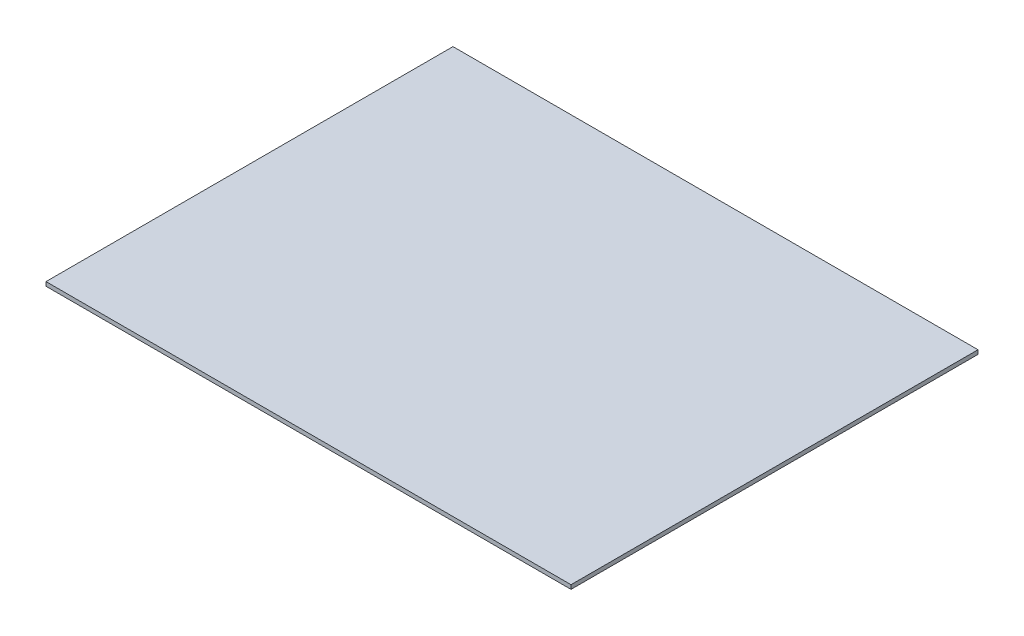
ISO-10303-21;
HEADER;
FILE_DESCRIPTION(('STEP AP214'),'2;1');
FILE_NAME('part.step','',(''),(''),'','','');
FILE_SCHEMA(('AUTOMOTIVE_DESIGN { 1 0 10303 214 1 1 1 1 }'));
ENDSEC;
DATA;
#1=APPLICATION_CONTEXT('core data for automotive mechanical design processes');
#2=APPLICATION_PROTOCOL_DEFINITION('international standard','automotive_design',2000,#1);
#3=PRODUCT_CONTEXT('',#1,'mechanical');
#4=PRODUCT('Part','Part','',(#3));
#5=PRODUCT_RELATED_PRODUCT_CATEGORY('part','',(#4));
#6=PRODUCT_DEFINITION_FORMATION('','',#4);
#7=PRODUCT_DEFINITION_CONTEXT('part definition',#1,'design');
#8=PRODUCT_DEFINITION('design','',#6,#7);
#9=PRODUCT_DEFINITION_SHAPE('','',#8);
#10=(LENGTH_UNIT() NAMED_UNIT(*) SI_UNIT(.MILLI.,.METRE.));
#11=(NAMED_UNIT(*) PLANE_ANGLE_UNIT() SI_UNIT($,.RADIAN.));
#12=(NAMED_UNIT(*) SI_UNIT($,.STERADIAN.) SOLID_ANGLE_UNIT());
#13=UNCERTAINTY_MEASURE_WITH_UNIT(LENGTH_MEASURE(1.E-05),#10,'distance_accuracy_value','');
#14=(GEOMETRIC_REPRESENTATION_CONTEXT(3) GLOBAL_UNCERTAINTY_ASSIGNED_CONTEXT((#13)) GLOBAL_UNIT_ASSIGNED_CONTEXT((#10,
#11,#12)) REPRESENTATION_CONTEXT('',''));
#15=CARTESIAN_POINT('',(0.,0.,0.));
#16=DIRECTION('',(0.,0.,1.));
#17=DIRECTION('',(1.,0.,0.));
#18=AXIS2_PLACEMENT_3D('',#15,#16,#17);
#19=CARTESIAN_POINT('',(-322.5,-59.9999999999972,1145.01937955382));
#20=DIRECTION('',(1.,0.,0.));
#21=DIRECTION('',(0.,0.,-1.));
#22=AXIS2_PLACEMENT_3D('',#19,#20,#21);
#23=PLANE('',#22);
#24=DIRECTION('',(0.,-1.,0.));
#25=VECTOR('',#24,1.);
#26=CARTESIAN_POINT('',(-322.5,-59.9999999999972,500.));
#27=LINE('',#26,#25);
#28=CARTESIAN_POINT('',(-322.5,-55.,500.));
#29=VERTEX_POINT('',#28);
#30=CARTESIAN_POINT('',(-322.5,-60.0000000000001,500.));
#31=VERTEX_POINT('',#30);
#32=EDGE_CURVE('E103',#29,#31,#27,.T.);
#33=ORIENTED_EDGE('',*,*,#32,.F.);
#34=DIRECTION('',(0.,0.,-1.));
#35=VECTOR('',#34,1.);
#36=CARTESIAN_POINT('',(-322.5,-54.9999999999983,1145.01937955382));
#37=LINE('',#36,#35);
#38=CARTESIAN_POINT('',(-322.5,-54.9999999999983,0.));
#39=VERTEX_POINT('',#38);
#40=EDGE_CURVE('E94',#29,#39,#37,.T.);
#41=ORIENTED_EDGE('',*,*,#40,.T.);
#42=DIRECTION('',(0.,-1.,0.));
#43=VECTOR('',#42,1.);
#44=CARTESIAN_POINT('',(-322.5,-59.9999999999972,0.));
#45=LINE('',#44,#43);
#46=CARTESIAN_POINT('',(-322.5,-59.9999999999972,0.));
#47=VERTEX_POINT('',#46);
#48=EDGE_CURVE('E85',#39,#47,#45,.T.);
#49=ORIENTED_EDGE('',*,*,#48,.T.);
#50=DIRECTION('',(0.,0.,-1.));
#51=VECTOR('',#50,1.);
#52=CARTESIAN_POINT('',(-322.5,-59.9999999999972,1145.01937955382));
#53=LINE('',#52,#51);
#54=EDGE_CURVE('E76',#31,#47,#53,.T.);
#55=ORIENTED_EDGE('',*,*,#54,.F.);
#56=EDGE_LOOP('',(#33,#41,#49,#55));
#57=FACE_BOUND('',#56,.T.);
#58=ADVANCED_FACE('F35',(#57),#23,.F.);
#59=CARTESIAN_POINT('',(-322.5,-59.9999999999972,1145.01937955382));
#60=DIRECTION('',(0.,1.,0.));
#61=DIRECTION('',(0.,0.,1.));
#62=AXIS2_PLACEMENT_3D('',#59,#60,#61);
#63=PLANE('',#62);
#64=DIRECTION('',(1.,0.,0.));
#65=VECTOR('',#64,1.);
#66=CARTESIAN_POINT('',(-322.5,-59.9999999999972,500.));
#67=LINE('',#66,#65);
#68=CARTESIAN_POINT('',(322.5,-60.0000000000001,500.));
#69=VERTEX_POINT('',#68);
#70=EDGE_CURVE('E82',#31,#69,#67,.T.);
#71=ORIENTED_EDGE('',*,*,#70,.F.);
#72=ORIENTED_EDGE('',*,*,#54,.T.);
#73=DIRECTION('',(1.,0.,0.));
#74=VECTOR('',#73,1.);
#75=CARTESIAN_POINT('',(-322.5,-59.9999999999972,0.));
#76=LINE('',#75,#74);
#77=CARTESIAN_POINT('',(322.5,-59.9999999999972,0.));
#78=VERTEX_POINT('',#77);
#79=EDGE_CURVE('E79',#47,#78,#76,.T.);
#80=ORIENTED_EDGE('',*,*,#79,.T.);
#81=DIRECTION('',(0.,0.,-1.));
#82=VECTOR('',#81,1.);
#83=CARTESIAN_POINT('',(322.5,-59.9999999999972,1145.01937955382));
#84=LINE('',#83,#82);
#85=EDGE_CURVE('E70',#69,#78,#84,.T.);
#86=ORIENTED_EDGE('',*,*,#85,.F.);
#87=EDGE_LOOP('',(#71,#72,#80,#86));
#88=FACE_BOUND('',#87,.T.);
#89=ADVANCED_FACE('F78',(#88),#63,.F.);
#90=CARTESIAN_POINT('',(322.5,-59.9999999999972,1145.01937955382));
#91=DIRECTION('',(-1.,0.,0.));
#92=DIRECTION('',(0.,0.,1.));
#93=AXIS2_PLACEMENT_3D('',#90,#91,#92);
#94=PLANE('',#93);
#95=DIRECTION('',(0.,1.,0.));
#96=VECTOR('',#95,1.);
#97=CARTESIAN_POINT('',(322.5,-59.9999999999972,500.));
#98=LINE('',#97,#96);
#99=CARTESIAN_POINT('',(322.5,-54.9999999999983,500.));
#100=VERTEX_POINT('',#99);
#101=EDGE_CURVE('E39',#69,#100,#98,.T.);
#102=ORIENTED_EDGE('',*,*,#101,.F.);
#103=ORIENTED_EDGE('',*,*,#85,.T.);
#104=DIRECTION('',(0.,1.,0.));
#105=VECTOR('',#104,1.);
#106=CARTESIAN_POINT('',(322.5,-59.9999999999972,0.));
#107=LINE('',#106,#105);
#108=CARTESIAN_POINT('',(322.5,-54.9999999999983,0.));
#109=VERTEX_POINT('',#108);
#110=EDGE_CURVE('E91',#78,#109,#107,.T.);
#111=ORIENTED_EDGE('',*,*,#110,.T.);
#112=DIRECTION('',(0.,0.,-1.));
#113=VECTOR('',#112,1.);
#114=CARTESIAN_POINT('',(322.5,-54.9999999999983,1145.01937955382));
#115=LINE('',#114,#113);
#116=EDGE_CURVE('E101',#100,#109,#115,.T.);
#117=ORIENTED_EDGE('',*,*,#116,.F.);
#118=EDGE_LOOP('',(#102,#103,#111,#117));
#119=FACE_BOUND('',#118,.T.);
#120=ADVANCED_FACE('F108',(#119),#94,.F.);
#121=CARTESIAN_POINT('',(-322.5,-54.9999999999983,1145.01937955382));
#122=DIRECTION('',(0.,-1.,0.));
#123=DIRECTION('',(0.,0.,-1.));
#124=AXIS2_PLACEMENT_3D('',#121,#122,#123);
#125=PLANE('',#124);
#126=DIRECTION('',(-1.,0.,0.));
#127=VECTOR('',#126,1.);
#128=CARTESIAN_POINT('',(-322.5,-54.9999999999983,500.));
#129=LINE('',#128,#127);
#130=EDGE_CURVE('E11',#100,#29,#129,.T.);
#131=ORIENTED_EDGE('',*,*,#130,.F.);
#132=ORIENTED_EDGE('',*,*,#116,.T.);
#133=DIRECTION('',(-1.,0.,0.));
#134=VECTOR('',#133,1.);
#135=CARTESIAN_POINT('',(-322.5,-54.9999999999983,0.));
#136=LINE('',#135,#134);
#137=EDGE_CURVE('E102',#109,#39,#136,.T.);
#138=ORIENTED_EDGE('',*,*,#137,.T.);
#139=ORIENTED_EDGE('',*,*,#40,.F.);
#140=EDGE_LOOP('',(#131,#132,#138,#139));
#141=FACE_BOUND('',#140,.T.);
#142=ADVANCED_FACE('F109',(#141),#125,.F.);
#143=CARTESIAN_POINT('',(-322.5,-54.9999999999983,0.));
#144=DIRECTION('',(0.,0.,-1.));
#145=DIRECTION('',(-1.,0.,0.));
#146=AXIS2_PLACEMENT_3D('',#143,#144,#145);
#147=PLANE('',#146);
#148=ORIENTED_EDGE('',*,*,#48,.F.);
#149=ORIENTED_EDGE('',*,*,#137,.F.);
#150=ORIENTED_EDGE('',*,*,#110,.F.);
#151=ORIENTED_EDGE('',*,*,#79,.F.);
#152=EDGE_LOOP('',(#148,#149,#150,#151));
#153=FACE_BOUND('',#152,.T.);
#154=ADVANCED_FACE('F89',(#153),#147,.T.);
#155=CARTESIAN_POINT('',(-332.5,-60.0000000000001,500.));
#156=DIRECTION('',(0.,0.,1.));
#157=DIRECTION('',(1.,0.,0.));
#158=AXIS2_PLACEMENT_3D('',#155,#156,#157);
#159=PLANE('',#158);
#160=ORIENTED_EDGE('',*,*,#32,.T.);
#161=ORIENTED_EDGE('',*,*,#70,.T.);
#162=ORIENTED_EDGE('',*,*,#101,.T.);
#163=ORIENTED_EDGE('',*,*,#130,.T.);
#164=EDGE_LOOP('',(#160,#161,#162,#163));
#165=FACE_BOUND('',#164,.T.);
#166=ADVANCED_FACE('F37',(#165),#159,.T.);
#167=CLOSED_SHELL('',(#58,#89,#120,#142,#154,#166));
#168=MANIFOLD_SOLID_BREP('B2',#167);
#169=ADVANCED_BREP_SHAPE_REPRESENTATION('',(#18,#168),#14);
#170=SHAPE_DEFINITION_REPRESENTATION(#9,#169);
ENDSEC;
END-ISO-10303-21;
